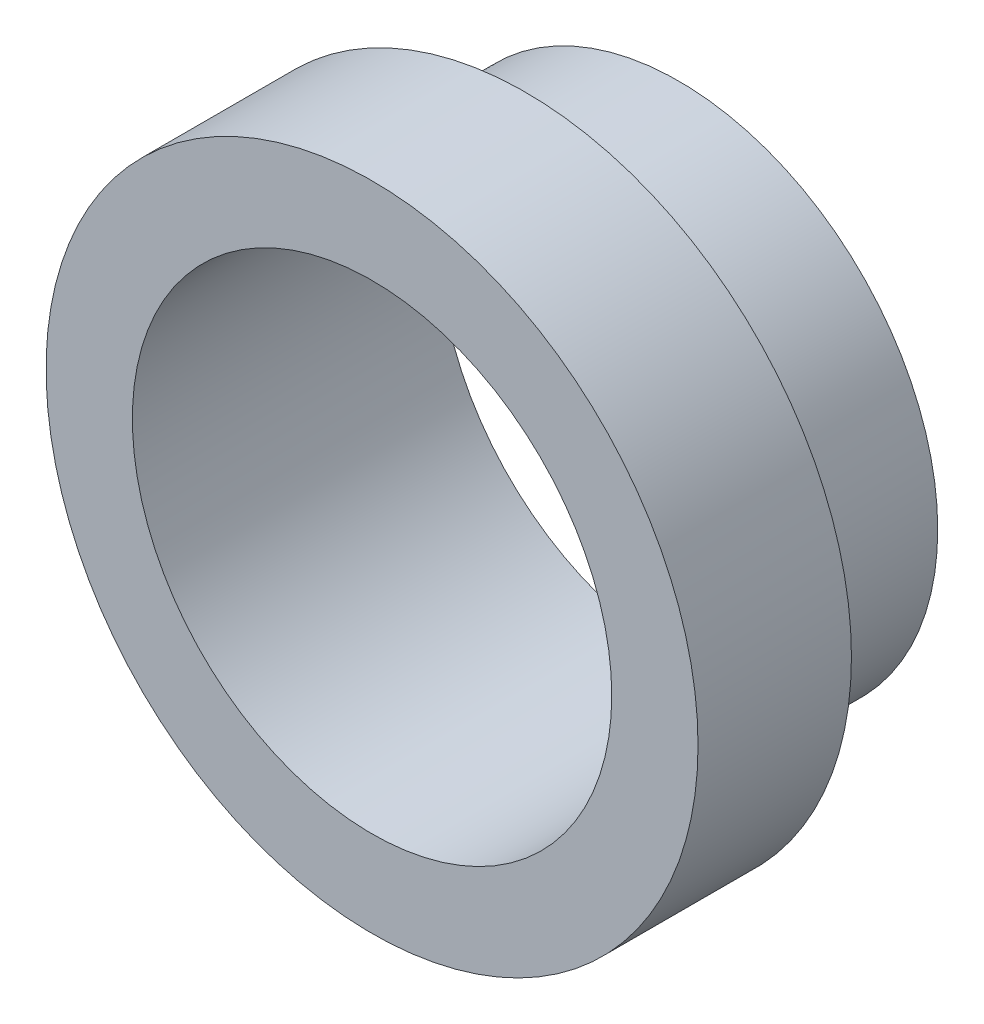
ISO-10303-21;
HEADER;
FILE_DESCRIPTION(('STEP AP214'),'2;1');
FILE_NAME('part.step','',(''),(''),'','','');
FILE_SCHEMA(('AUTOMOTIVE_DESIGN { 1 0 10303 214 1 1 1 1 }'));
ENDSEC;
DATA;
#1=APPLICATION_CONTEXT('core data for automotive mechanical design processes');
#2=APPLICATION_PROTOCOL_DEFINITION('international standard','automotive_design',2000,#1);
#3=PRODUCT_CONTEXT('',#1,'mechanical');
#4=PRODUCT('Part','Part','',(#3));
#5=PRODUCT_RELATED_PRODUCT_CATEGORY('part','',(#4));
#6=PRODUCT_DEFINITION_FORMATION('','',#4);
#7=PRODUCT_DEFINITION_CONTEXT('part definition',#1,'design');
#8=PRODUCT_DEFINITION('design','',#6,#7);
#9=PRODUCT_DEFINITION_SHAPE('','',#8);
#10=(LENGTH_UNIT() NAMED_UNIT(*) SI_UNIT(.MILLI.,.METRE.));
#11=(NAMED_UNIT(*) PLANE_ANGLE_UNIT() SI_UNIT($,.RADIAN.));
#12=(NAMED_UNIT(*) SI_UNIT($,.STERADIAN.) SOLID_ANGLE_UNIT());
#13=UNCERTAINTY_MEASURE_WITH_UNIT(LENGTH_MEASURE(1.E-05),#10,'distance_accuracy_value','');
#14=(GEOMETRIC_REPRESENTATION_CONTEXT(3) GLOBAL_UNCERTAINTY_ASSIGNED_CONTEXT((#13)) GLOBAL_UNIT_ASSIGNED_CONTEXT((#10,
#11,#12)) REPRESENTATION_CONTEXT('',''));
#15=CARTESIAN_POINT('',(0.,0.,0.));
#16=DIRECTION('',(0.,0.,1.));
#17=DIRECTION('',(1.,0.,0.));
#18=AXIS2_PLACEMENT_3D('',#15,#16,#17);
#19=CARTESIAN_POINT('',(0.,0.,47.5));
#20=DIRECTION('',(0.,0.,1.));
#21=DIRECTION('',(1.,0.,0.));
#22=AXIS2_PLACEMENT_3D('',#19,#20,#21);
#23=PLANE('',#22);
#24=CARTESIAN_POINT('',(0.,0.,47.5));
#25=DIRECTION('',(0.,0.,1.));
#26=DIRECTION('',(1.,0.,0.));
#27=AXIS2_PLACEMENT_3D('',#24,#25,#26);
#28=CIRCLE('',#27,13.5);
#29=CARTESIAN_POINT('',(13.5,0.,47.5));
#30=VERTEX_POINT('',#29);
#31=EDGE_CURVE('E40',#30,#30,#28,.T.);
#32=ORIENTED_EDGE('',*,*,#31,.F.);
#33=EDGE_LOOP('',(#32));
#34=FACE_BOUND('',#33,.T.);
#35=CARTESIAN_POINT('',(0.,0.,47.5));
#36=DIRECTION('',(0.,0.,1.));
#37=DIRECTION('',(1.,0.,0.));
#38=AXIS2_PLACEMENT_3D('',#35,#36,#37);
#39=CIRCLE('',#38,12.5);
#40=CARTESIAN_POINT('',(12.5,0.,47.5));
#41=VERTEX_POINT('',#40);
#42=EDGE_CURVE('E50',#41,#41,#39,.T.);
#43=ORIENTED_EDGE('',*,*,#42,.T.);
#44=EDGE_LOOP('',(#43));
#45=FACE_BOUND('',#44,.T.);
#46=ADVANCED_FACE('F36',(#34,#45),#23,.F.);
#47=CARTESIAN_POINT('',(0.,0.,55.5));
#48=DIRECTION('',(0.,0.,-1.));
#49=DIRECTION('',(-1.,0.,0.));
#50=AXIS2_PLACEMENT_3D('',#47,#48,#49);
#51=CYLINDRICAL_SURFACE('',#50,13.5);
#52=CARTESIAN_POINT('',(0.,0.,55.5));
#53=DIRECTION('',(0.,0.,1.));
#54=DIRECTION('',(1.,0.,0.));
#55=AXIS2_PLACEMENT_3D('',#52,#53,#54);
#56=CIRCLE('',#55,13.5);
#57=CARTESIAN_POINT('',(13.5,0.,55.5));
#58=VERTEX_POINT('',#57);
#59=EDGE_CURVE('E10',#58,#58,#56,.T.);
#60=ORIENTED_EDGE('',*,*,#59,.F.);
#61=EDGE_LOOP('',(#60));
#62=FACE_BOUND('',#61,.T.);
#63=ORIENTED_EDGE('',*,*,#31,.T.);
#64=EDGE_LOOP('',(#63));
#65=FACE_BOUND('',#64,.T.);
#66=ADVANCED_FACE('F38',(#62,#65),#51,.T.);
#67=CARTESIAN_POINT('',(0.,0.,55.5));
#68=DIRECTION('',(0.,0.,-1.));
#69=DIRECTION('',(-1.,0.,0.));
#70=AXIS2_PLACEMENT_3D('',#67,#68,#69);
#71=CYLINDRICAL_SURFACE('',#70,12.5);
#72=ORIENTED_EDGE('',*,*,#42,.F.);
#73=EDGE_LOOP('',(#72));
#74=FACE_BOUND('',#73,.T.);
#75=CARTESIAN_POINT('',(0.,0.,63.5));
#76=DIRECTION('',(0.,0.,1.));
#77=DIRECTION('',(1.,0.,0.));
#78=AXIS2_PLACEMENT_3D('',#75,#76,#77);
#79=CIRCLE('',#78,12.5);
#80=CARTESIAN_POINT('',(12.5,0.,63.5));
#81=VERTEX_POINT('',#80);
#82=EDGE_CURVE('E60',#81,#81,#79,.T.);
#83=ORIENTED_EDGE('',*,*,#82,.T.);
#84=EDGE_LOOP('',(#83));
#85=FACE_BOUND('',#84,.T.);
#86=ADVANCED_FACE('F67',(#74,#85),#71,.F.);
#87=CARTESIAN_POINT('',(0.,0.,63.5));
#88=DIRECTION('',(0.,0.,1.));
#89=DIRECTION('',(1.,0.,0.));
#90=AXIS2_PLACEMENT_3D('',#87,#88,#89);
#91=PLANE('',#90);
#92=CARTESIAN_POINT('',(0.,0.,63.5));
#93=DIRECTION('',(0.,0.,1.));
#94=DIRECTION('',(1.,0.,0.));
#95=AXIS2_PLACEMENT_3D('',#92,#93,#94);
#96=CIRCLE('',#95,17.);
#97=CARTESIAN_POINT('',(17.,0.,63.5));
#98=VERTEX_POINT('',#97);
#99=EDGE_CURVE('E55',#98,#98,#96,.T.);
#100=ORIENTED_EDGE('',*,*,#99,.T.);
#101=EDGE_LOOP('',(#100));
#102=FACE_BOUND('',#101,.T.);
#103=ORIENTED_EDGE('',*,*,#82,.F.);
#104=EDGE_LOOP('',(#103));
#105=FACE_BOUND('',#104,.T.);
#106=ADVANCED_FACE('F69',(#102,#105),#91,.T.);
#107=CARTESIAN_POINT('',(0.,0.,55.5));
#108=DIRECTION('',(0.,0.,1.));
#109=DIRECTION('',(1.,0.,0.));
#110=AXIS2_PLACEMENT_3D('',#107,#108,#109);
#111=PLANE('',#110);
#112=ORIENTED_EDGE('',*,*,#59,.T.);
#113=EDGE_LOOP('',(#112));
#114=FACE_BOUND('',#113,.T.);
#115=CARTESIAN_POINT('',(0.,0.,55.5));
#116=DIRECTION('',(0.,0.,1.));
#117=DIRECTION('',(1.,0.,0.));
#118=AXIS2_PLACEMENT_3D('',#115,#116,#117);
#119=CIRCLE('',#118,17.);
#120=CARTESIAN_POINT('',(17.,0.,55.5));
#121=VERTEX_POINT('',#120);
#122=EDGE_CURVE('E56',#121,#121,#119,.T.);
#123=ORIENTED_EDGE('',*,*,#122,.F.);
#124=EDGE_LOOP('',(#123));
#125=FACE_BOUND('',#124,.T.);
#126=ADVANCED_FACE('F71',(#114,#125),#111,.F.);
#127=CARTESIAN_POINT('',(0.,0.,63.5));
#128=DIRECTION('',(0.,0.,-1.));
#129=DIRECTION('',(-1.,0.,0.));
#130=AXIS2_PLACEMENT_3D('',#127,#128,#129);
#131=CYLINDRICAL_SURFACE('',#130,17.);
#132=ORIENTED_EDGE('',*,*,#99,.F.);
#133=EDGE_LOOP('',(#132));
#134=FACE_BOUND('',#133,.T.);
#135=ORIENTED_EDGE('',*,*,#122,.T.);
#136=EDGE_LOOP('',(#135));
#137=FACE_BOUND('',#136,.T.);
#138=ADVANCED_FACE('F78',(#134,#137),#131,.T.);
#139=CLOSED_SHELL('',(#46,#66,#86,#106,#126,#138));
#140=MANIFOLD_SOLID_BREP('B2',#139);
#141=ADVANCED_BREP_SHAPE_REPRESENTATION('',(#18,#140),#14);
#142=SHAPE_DEFINITION_REPRESENTATION(#9,#141);
ENDSEC;
END-ISO-10303-21;
